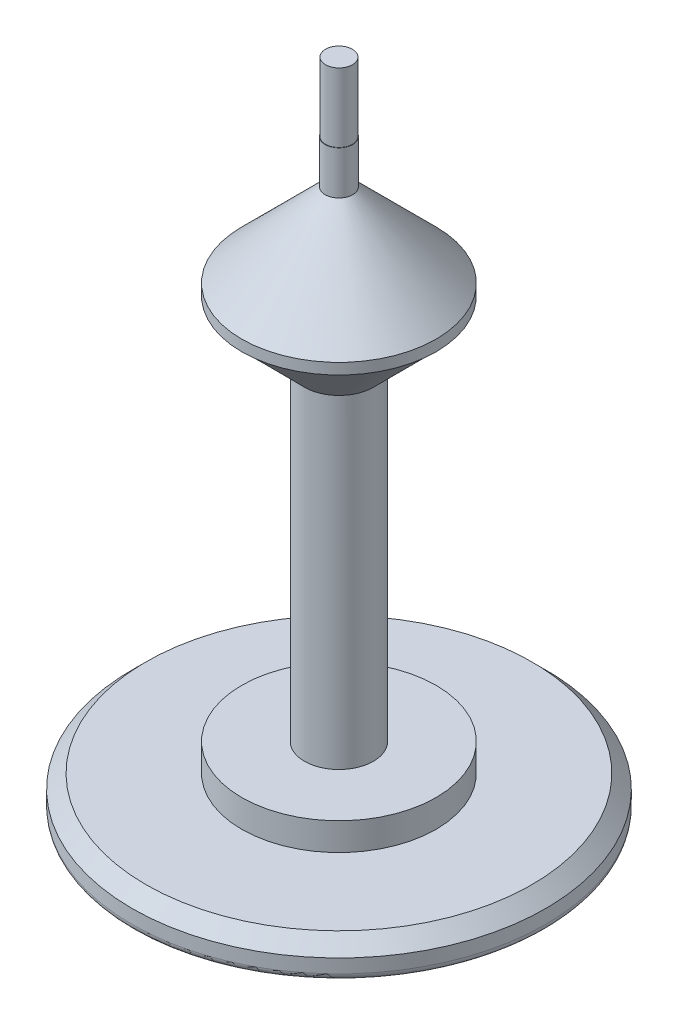
ISO-10303-21;
HEADER;
FILE_DESCRIPTION(('STEP AP214'),'2;1');
FILE_NAME('part.step','',(''),(''),'','','');
FILE_SCHEMA(('AUTOMOTIVE_DESIGN { 1 0 10303 214 1 1 1 1 }'));
ENDSEC;
DATA;
#1=APPLICATION_CONTEXT('core data for automotive mechanical design processes');
#2=APPLICATION_PROTOCOL_DEFINITION('international standard','automotive_design',2000,#1);
#3=PRODUCT_CONTEXT('',#1,'mechanical');
#4=PRODUCT('Part','Part','',(#3));
#5=PRODUCT_RELATED_PRODUCT_CATEGORY('part','',(#4));
#6=PRODUCT_DEFINITION_FORMATION('','',#4);
#7=PRODUCT_DEFINITION_CONTEXT('part definition',#1,'design');
#8=PRODUCT_DEFINITION('design','',#6,#7);
#9=PRODUCT_DEFINITION_SHAPE('','',#8);
#10=(LENGTH_UNIT() NAMED_UNIT(*) SI_UNIT(.MILLI.,.METRE.));
#11=(NAMED_UNIT(*) PLANE_ANGLE_UNIT() SI_UNIT($,.RADIAN.));
#12=(NAMED_UNIT(*) SI_UNIT($,.STERADIAN.) SOLID_ANGLE_UNIT());
#13=UNCERTAINTY_MEASURE_WITH_UNIT(LENGTH_MEASURE(1.E-05),#10,'distance_accuracy_value','');
#14=(GEOMETRIC_REPRESENTATION_CONTEXT(3) GLOBAL_UNCERTAINTY_ASSIGNED_CONTEXT((#13)) GLOBAL_UNIT_ASSIGNED_CONTEXT((#10,
#11,#12)) REPRESENTATION_CONTEXT('',''));
#15=CARTESIAN_POINT('',(0.,0.,0.));
#16=DIRECTION('',(0.,0.,1.));
#17=DIRECTION('',(1.,0.,0.));
#18=AXIS2_PLACEMENT_3D('',#15,#16,#17);
#19=CARTESIAN_POINT('',(0.,79.3548387096774,0.));
#20=DIRECTION('',(0.,1.,0.));
#21=DIRECTION('',(0.,0.,1.));
#22=AXIS2_PLACEMENT_3D('',#19,#20,#21);
#23=CYLINDRICAL_SURFACE('',#22,30.);
#24=CARTESIAN_POINT('',(0.,-52.1048387096774,0.));
#25=DIRECTION('',(0.,-1.,0.));
#26=DIRECTION('',(0.,0.,-1.));
#27=AXIS2_PLACEMENT_3D('',#24,#25,#26);
#28=CIRCLE('',#27,30.);
#29=CARTESIAN_POINT('',(0.,-52.1048387096774,-30.));
#30=VERTEX_POINT('',#29);
#31=EDGE_CURVE('E49',#30,#30,#28,.F.);
#32=ORIENTED_EDGE('',*,*,#31,.T.);
#33=EDGE_LOOP('',(#32));
#34=FACE_BOUND('',#33,.T.);
#35=CARTESIAN_POINT('',(0.,-50.1048387096775,0.));
#36=DIRECTION('',(0.,1.,0.));
#37=DIRECTION('',(0.,0.,1.));
#38=AXIS2_PLACEMENT_3D('',#35,#36,#37);
#39=CIRCLE('',#38,30.);
#40=CARTESIAN_POINT('',(0.,-50.1048387096775,30.));
#41=VERTEX_POINT('',#40);
#42=EDGE_CURVE('E54',#41,#41,#39,.F.);
#43=ORIENTED_EDGE('',*,*,#42,.T.);
#44=EDGE_LOOP('',(#43));
#45=FACE_BOUND('',#44,.T.);
#46=ADVANCED_FACE('F34',(#34,#45),#23,.T.);
#47=CARTESIAN_POINT('',(-30.,-48.1048387096774,0.));
#48=DIRECTION('',(0.,1.,0.));
#49=DIRECTION('',(0.,0.,1.));
#50=AXIS2_PLACEMENT_3D('',#47,#48,#49);
#51=PLANE('',#50);
#52=CARTESIAN_POINT('',(0.,-48.1048387096774,0.));
#53=DIRECTION('',(0.,1.,0.));
#54=DIRECTION('',(0.,0.,1.));
#55=AXIS2_PLACEMENT_3D('',#52,#53,#54);
#56=CIRCLE('',#55,27.9999999999999);
#57=CARTESIAN_POINT('',(0.,-48.1048387096774,27.9999999999999));
#58=VERTEX_POINT('',#57);
#59=EDGE_CURVE('E57',#58,#58,#56,.T.);
#60=ORIENTED_EDGE('',*,*,#59,.T.);
#61=EDGE_LOOP('',(#60));
#62=FACE_BOUND('',#61,.T.);
#63=CARTESIAN_POINT('',(0.,-48.1048387096774,0.));
#64=DIRECTION('',(0.,1.,0.));
#65=DIRECTION('',(0.,0.,1.));
#66=AXIS2_PLACEMENT_3D('',#63,#64,#65);
#67=CIRCLE('',#66,14.1);
#68=CARTESIAN_POINT('',(0.,-48.1048387096774,14.1));
#69=VERTEX_POINT('',#68);
#70=EDGE_CURVE('E66',#69,#69,#67,.T.);
#71=ORIENTED_EDGE('',*,*,#70,.F.);
#72=EDGE_LOOP('',(#71));
#73=FACE_BOUND('',#72,.T.);
#74=ADVANCED_FACE('F120',(#62,#73),#51,.T.);
#75=CARTESIAN_POINT('',(0.,79.3548387096774,0.));
#76=DIRECTION('',(0.,1.,0.));
#77=DIRECTION('',(0.,0.,1.));
#78=AXIS2_PLACEMENT_3D('',#75,#76,#77);
#79=CYLINDRICAL_SURFACE('',#78,14.1);
#80=ORIENTED_EDGE('',*,*,#70,.T.);
#81=EDGE_LOOP('',(#80));
#82=FACE_BOUND('',#81,.T.);
#83=CARTESIAN_POINT('',(0.,-44.1048387096774,0.));
#84=DIRECTION('',(0.,1.,0.));
#85=DIRECTION('',(0.,0.,1.));
#86=AXIS2_PLACEMENT_3D('',#83,#84,#85);
#87=CIRCLE('',#86,14.1);
#88=CARTESIAN_POINT('',(0.,-44.1048387096774,14.1));
#89=VERTEX_POINT('',#88);
#90=EDGE_CURVE('E69',#89,#89,#87,.T.);
#91=ORIENTED_EDGE('',*,*,#90,.F.);
#92=EDGE_LOOP('',(#91));
#93=FACE_BOUND('',#92,.T.);
#94=ADVANCED_FACE('F126',(#82,#93),#79,.T.);
#95=CARTESIAN_POINT('',(-14.1,-44.1048387096774,0.));
#96=DIRECTION('',(0.,1.,0.));
#97=DIRECTION('',(0.,0.,1.));
#98=AXIS2_PLACEMENT_3D('',#95,#96,#97);
#99=PLANE('',#98);
#100=ORIENTED_EDGE('',*,*,#90,.T.);
#101=EDGE_LOOP('',(#100));
#102=FACE_BOUND('',#101,.T.);
#103=CARTESIAN_POINT('',(0.,-44.1048387096774,0.));
#104=DIRECTION('',(0.,1.,0.));
#105=DIRECTION('',(0.,0.,1.));
#106=AXIS2_PLACEMENT_3D('',#103,#104,#105);
#107=CIRCLE('',#106,4.99999999999999);
#108=CARTESIAN_POINT('',(0.,-44.1048387096774,4.99999999999999));
#109=VERTEX_POINT('',#108);
#110=EDGE_CURVE('E72',#109,#109,#107,.T.);
#111=ORIENTED_EDGE('',*,*,#110,.F.);
#112=EDGE_LOOP('',(#111));
#113=FACE_BOUND('',#112,.T.);
#114=ADVANCED_FACE('F169',(#102,#113),#99,.T.);
#115=CARTESIAN_POINT('',(0.,79.3548387096774,0.));
#116=DIRECTION('',(0.,1.,0.));
#117=DIRECTION('',(0.,0.,1.));
#118=AXIS2_PLACEMENT_3D('',#115,#116,#117);
#119=CYLINDRICAL_SURFACE('',#118,4.99999999999999);
#120=CARTESIAN_POINT('',(0.,2.89516129032265,0.));
#121=DIRECTION('',(0.,-1.,0.));
#122=DIRECTION('',(0.,0.,-1.));
#123=AXIS2_PLACEMENT_3D('',#120,#121,#122);
#124=CIRCLE('',#123,4.99999999999999);
#125=CARTESIAN_POINT('',(0.,2.89516129032265,-4.99999999999999));
#126=VERTEX_POINT('',#125);
#127=EDGE_CURVE('E10',#126,#126,#124,.T.);
#128=ORIENTED_EDGE('',*,*,#127,.T.);
#129=EDGE_LOOP('',(#128));
#130=FACE_BOUND('',#129,.T.);
#131=ORIENTED_EDGE('',*,*,#110,.T.);
#132=EDGE_LOOP('',(#131));
#133=FACE_BOUND('',#132,.T.);
#134=ADVANCED_FACE('F159',(#130,#133),#119,.T.);
#135=CARTESIAN_POINT('',(-4.99999999999999,11.8951612903226,0.));
#136=DIRECTION('',(0.,-1.,0.));
#137=DIRECTION('',(0.,0.,-1.));
#138=AXIS2_PLACEMENT_3D('',#135,#136,#137);
#139=PLANE('',#138);
#140=CARTESIAN_POINT('',(0.,11.8951612903226,0.));
#141=DIRECTION('',(0.,-1.,0.));
#142=DIRECTION('',(0.,0.,-1.));
#143=AXIS2_PLACEMENT_3D('',#140,#141,#142);
#144=CIRCLE('',#143,14.);
#145=CARTESIAN_POINT('',(0.,11.8951612903226,-14.));
#146=VERTEX_POINT('',#145);
#147=EDGE_CURVE('E41',#146,#146,#144,.F.);
#148=ORIENTED_EDGE('',*,*,#147,.T.);
#149=EDGE_LOOP('',(#148));
#150=FACE_BOUND('',#149,.T.);
#151=CARTESIAN_POINT('',(0.,11.8951612903226,0.));
#152=DIRECTION('',(0.,1.,0.));
#153=DIRECTION('',(0.,0.,1.));
#154=AXIS2_PLACEMENT_3D('',#151,#152,#153);
#155=CIRCLE('',#154,14.1);
#156=CARTESIAN_POINT('',(0.,11.8951612903226,14.1));
#157=VERTEX_POINT('',#156);
#158=EDGE_CURVE('E75',#157,#157,#155,.T.);
#159=ORIENTED_EDGE('',*,*,#158,.F.);
#160=EDGE_LOOP('',(#159));
#161=FACE_BOUND('',#160,.T.);
#162=ADVANCED_FACE('F154',(#150,#161),#139,.T.);
#163=CARTESIAN_POINT('',(0.,79.3548387096774,0.));
#164=DIRECTION('',(0.,1.,0.));
#165=DIRECTION('',(0.,0.,1.));
#166=AXIS2_PLACEMENT_3D('',#163,#164,#165);
#167=CYLINDRICAL_SURFACE('',#166,14.1);
#168=CARTESIAN_POINT('',(0.,13.4889435076735,0.));
#169=DIRECTION('',(0.,-1.,0.));
#170=DIRECTION('',(0.,0.,-1.));
#171=AXIS2_PLACEMENT_3D('',#168,#169,#170);
#172=CIRCLE('',#171,14.1);
#173=CARTESIAN_POINT('',(0.,13.4889435076735,-14.1));
#174=VERTEX_POINT('',#173);
#175=EDGE_CURVE('E61',#174,#174,#172,.F.);
#176=ORIENTED_EDGE('',*,*,#175,.F.);
#177=EDGE_LOOP('',(#176));
#178=FACE_BOUND('',#177,.T.);
#179=ORIENTED_EDGE('',*,*,#158,.T.);
#180=EDGE_LOOP('',(#179));
#181=FACE_BOUND('',#180,.T.);
#182=ADVANCED_FACE('F116',(#178,#181),#167,.T.);
#183=CARTESIAN_POINT('',(-30.,-53.1048387096774,0.));
#184=DIRECTION('',(0.,-1.,0.));
#185=DIRECTION('',(0.,0.,-1.));
#186=AXIS2_PLACEMENT_3D('',#183,#184,#185);
#187=PLANE('',#186);
#188=CARTESIAN_POINT('',(0.,-53.1048387096774,0.));
#189=DIRECTION('',(0.,-1.,0.));
#190=DIRECTION('',(0.,0.,-1.));
#191=AXIS2_PLACEMENT_3D('',#188,#189,#190);
#192=CIRCLE('',#191,29.);
#193=CARTESIAN_POINT('',(0.,-53.1048387096774,-29.));
#194=VERTEX_POINT('',#193);
#195=EDGE_CURVE('E45',#194,#194,#192,.T.);
#196=ORIENTED_EDGE('',*,*,#195,.T.);
#197=EDGE_LOOP('',(#196));
#198=FACE_BOUND('',#197,.T.);
#199=ADVANCED_FACE('F110',(#198),#187,.T.);
#200=CARTESIAN_POINT('',(0.,13.3389435076735,0.));
#201=DIRECTION('',(0.,-1.,0.));
#202=DIRECTION('',(0.,0.,-1.));
#203=AXIS2_PLACEMENT_3D('',#200,#201,#202);
#204=CONICAL_SURFACE('',#203,14.25,0.78539816339745);
#205=CARTESIAN_POINT('',(0.,25.5889435076734,0.));
#206=DIRECTION('',(0.,1.,0.));
#207=DIRECTION('',(0.,0.,1.));
#208=AXIS2_PLACEMENT_3D('',#205,#206,#207);
#209=CIRCLE('',#208,2.);
#210=CARTESIAN_POINT('',(0.,25.5889435076734,-2.));
#211=VERTEX_POINT('',#210);
#212=EDGE_CURVE('E65',#211,#211,#209,.T.);
#213=CARTESIAN_POINT('',(0.,13.4889435076735,-14.1));
#214=CARTESIAN_POINT('',(0.,13.6149851743402,-13.9739583333333));
#215=CARTESIAN_POINT('',(0.,13.7410268410068,-13.8479166666667));
#216=CARTESIAN_POINT('',(0.,13.9931101743402,-13.5958333333333));
#217=CARTESIAN_POINT('',(0.,14.1191518410068,-13.4697916666667));
#218=CARTESIAN_POINT('',(0.,14.3712351743402,-13.2177083333333));
#219=CARTESIAN_POINT('',(0.,14.4972768410068,-13.0916666666667));
#220=CARTESIAN_POINT('',(0.,14.7493601743402,-12.8395833333333));
#221=CARTESIAN_POINT('',(0.,14.8754018410068,-12.7135416666667));
#222=CARTESIAN_POINT('',(0.,15.1274851743402,-12.4614583333333));
#223=CARTESIAN_POINT('',(0.,15.2535268410068,-12.3354166666667));
#224=CARTESIAN_POINT('',(0.,15.5056101743402,-12.0833333333333));
#225=CARTESIAN_POINT('',(0.,15.6316518410068,-11.9572916666667));
#226=CARTESIAN_POINT('',(0.,15.8837351743402,-11.7052083333333));
#227=CARTESIAN_POINT('',(0.,16.0097768410068,-11.5791666666667));
#228=CARTESIAN_POINT('',(0.,16.2618601743402,-11.3270833333333));
#229=CARTESIAN_POINT('',(0.,16.3879018410068,-11.2010416666667));
#230=CARTESIAN_POINT('',(0.,16.6399851743402,-10.9489583333333));
#231=CARTESIAN_POINT('',(0.,16.7660268410068,-10.8229166666667));
#232=CARTESIAN_POINT('',(0.,17.0181101743401,-10.5708333333333));
#233=CARTESIAN_POINT('',(0.,17.1441518410068,-10.4447916666667));
#234=CARTESIAN_POINT('',(0.,17.3962351743401,-10.1927083333333));
#235=CARTESIAN_POINT('',(0.,17.5222768410068,-10.0666666666667));
#236=CARTESIAN_POINT('',(0.,17.7743601743401,-9.81458333333332));
#237=CARTESIAN_POINT('',(0.,17.9004018410068,-9.68854166666666));
#238=CARTESIAN_POINT('',(0.,18.1524851743401,-9.43645833333332));
#239=CARTESIAN_POINT('',(0.,18.2785268410068,-9.31041666666665));
#240=CARTESIAN_POINT('',(0.,18.5306101743401,-9.05833333333332));
#241=CARTESIAN_POINT('',(0.,18.6566518410068,-8.93229166666665));
#242=CARTESIAN_POINT('',(0.,18.9087351743401,-8.68020833333332));
#243=CARTESIAN_POINT('',(0.,19.0347768410068,-8.55416666666665));
#244=CARTESIAN_POINT('',(0.,19.2868601743401,-8.30208333333332));
#245=CARTESIAN_POINT('',(0.,19.4129018410068,-8.17604166666666));
#246=CARTESIAN_POINT('',(0.,19.6649851743401,-7.92395833333332));
#247=CARTESIAN_POINT('',(0.,19.7910268410068,-7.79791666666666));
#248=CARTESIAN_POINT('',(0.,20.0431101743401,-7.54583333333332));
#249=CARTESIAN_POINT('',(0.,20.1691518410068,-7.41979166666666));
#250=CARTESIAN_POINT('',(0.,20.4212351743401,-7.16770833333333));
#251=CARTESIAN_POINT('',(0.,20.5472768410068,-7.04166666666666));
#252=CARTESIAN_POINT('',(0.,20.7993601743401,-6.78958333333333));
#253=CARTESIAN_POINT('',(0.,20.9254018410068,-6.66354166666666));
#254=CARTESIAN_POINT('',(0.,21.1774851743401,-6.41145833333333));
#255=CARTESIAN_POINT('',(0.,21.3035268410068,-6.28541666666666));
#256=CARTESIAN_POINT('',(0.,21.5556101743401,-6.03333333333333));
#257=CARTESIAN_POINT('',(0.,21.6816518410068,-5.90729166666666));
#258=CARTESIAN_POINT('',(0.,21.9337351743401,-5.65520833333333));
#259=CARTESIAN_POINT('',(0.,22.0597768410068,-5.52916666666666));
#260=CARTESIAN_POINT('',(0.,22.3118601743401,-5.27708333333333));
#261=CARTESIAN_POINT('',(0.,22.4379018410068,-5.15104166666666));
#262=CARTESIAN_POINT('',(0.,22.6899851743401,-4.89895833333333));
#263=CARTESIAN_POINT('',(0.,22.8160268410068,-4.77291666666666));
#264=CARTESIAN_POINT('',(0.,23.0681101743401,-4.52083333333333));
#265=CARTESIAN_POINT('',(0.,23.1941518410068,-4.39479166666666));
#266=CARTESIAN_POINT('',(0.,23.4462351743401,-4.14270833333333));
#267=CARTESIAN_POINT('',(0.,23.5722768410068,-4.01666666666666));
#268=CARTESIAN_POINT('',(0.,23.8243601743401,-3.76458333333333));
#269=CARTESIAN_POINT('',(0.,23.9504018410068,-3.63854166666666));
#270=CARTESIAN_POINT('',(0.,24.2024851743401,-3.38645833333333));
#271=CARTESIAN_POINT('',(0.,24.3285268410068,-3.26041666666666));
#272=CARTESIAN_POINT('',(0.,24.5806101743401,-3.00833333333333));
#273=CARTESIAN_POINT('',(0.,24.7066518410068,-2.88229166666666));
#274=CARTESIAN_POINT('',(0.,24.9587351743401,-2.63020833333333));
#275=CARTESIAN_POINT('',(0.,25.0847768410068,-2.50416666666666));
#276=CARTESIAN_POINT('',(0.,25.3368601743401,-2.25208333333333));
#277=CARTESIAN_POINT('',(0.,25.4629018410068,-2.12604166666666));
#278=CARTESIAN_POINT('',(0.,25.5889435076734,-2.));
#279=B_SPLINE_CURVE_WITH_KNOTS('',3,(#213,#214,#215,#216,#217,#218,#219,#220,#221,#222,#223,
#224,#225,#226,#227,#228,#229,#230,#231,#232,#233,#234,#235,#236,#237,#238,#239,#240,#241,#242,
#243,#244,#245,#246,#247,#248,#249,#250,#251,#252,#253,#254,#255,#256,#257,#258,#259,#260,#261,
#262,#263,#264,#265,#266,#267,#268,#269,#270,#271,#272,#273,#274,#275,#276,#277,#278),
.UNSPECIFIED.,.F.,.F.,(4,2,2,2,2,2,2,2,2,2,2,2,2,2,2,2,2,2,2,2,2,2,2,2,2,2,2,2,2,2,2,2,4),(0.,
0.534749503272325,1.06949900654465,1.60424850981698,2.1389980130893,2.67374751636163,
3.20849701963395,3.74324652290628,4.2779960261786,4.81274552945093,5.34749503272325,
5.88224453599558,6.4169940392679,6.95174354254023,7.48649304581255,8.02124254908488,
8.5559920523572,9.09074155562953,9.62549105890185,10.1602405621742,10.6949900654465,
11.2297395687188,11.7644890719912,12.2992385752635,12.8339880785358,13.3687375818081,
13.9034870850805,14.4382365883528,14.9729860916251,15.5077355948974,16.0424850981698,
16.5772346014421,17.1119841047144),.UNSPECIFIED.);
#280=EDGE_CURVE('BSEAM100',#174,#211,#279,.T.);
#281=ORIENTED_EDGE('',*,*,#175,.T.);
#282=ORIENTED_EDGE('',*,*,#212,.F.);
#283=ORIENTED_EDGE('',*,*,#280,.T.);
#284=ORIENTED_EDGE('',*,*,#280,.F.);
#285=EDGE_LOOP('',(#281,#283,#282,#284));
#286=FACE_BOUND('',#285,.T.);
#287=ADVANCED_FACE('F100',(#286),#204,.T.);
#288=CARTESIAN_POINT('',(-1.99999999999998,31.8951612903226,0.));
#289=DIRECTION('',(0.,1.,0.));
#290=DIRECTION('',(0.,0.,1.));
#291=AXIS2_PLACEMENT_3D('',#288,#289,#290);
#292=PLANE('',#291);
#293=CARTESIAN_POINT('',(0.,31.8951612903226,0.));
#294=DIRECTION('',(0.,1.,0.));
#295=DIRECTION('',(0.,0.,1.));
#296=AXIS2_PLACEMENT_3D('',#293,#294,#295);
#297=CIRCLE('',#296,1.95);
#298=CARTESIAN_POINT('',(0.,31.8951612903226,1.95));
#299=VERTEX_POINT('',#298);
#300=EDGE_CURVE('E60',#299,#299,#297,.T.);
#301=ORIENTED_EDGE('',*,*,#300,.F.);
#302=EDGE_LOOP('',(#301));
#303=FACE_BOUND('',#302,.T.);
#304=CARTESIAN_POINT('',(0.,31.8951612903226,0.));
#305=DIRECTION('',(0.,1.,0.));
#306=DIRECTION('',(0.,0.,1.));
#307=AXIS2_PLACEMENT_3D('',#304,#305,#306);
#308=CIRCLE('',#307,1.99999999999998);
#309=CARTESIAN_POINT('',(0.,31.8951612903226,1.99999999999998));
#310=VERTEX_POINT('',#309);
#311=EDGE_CURVE('E64',#310,#310,#308,.T.);
#312=ORIENTED_EDGE('',*,*,#311,.T.);
#313=EDGE_LOOP('',(#312));
#314=FACE_BOUND('',#313,.T.);
#315=ADVANCED_FACE('F97',(#303,#314),#292,.T.);
#316=CARTESIAN_POINT('',(0.,79.3548387096774,0.));
#317=DIRECTION('',(0.,1.,0.));
#318=DIRECTION('',(0.,0.,1.));
#319=AXIS2_PLACEMENT_3D('',#316,#317,#318);
#320=CYLINDRICAL_SURFACE('',#319,1.99999999999998);
#321=ORIENTED_EDGE('',*,*,#311,.F.);
#322=EDGE_LOOP('',(#321));
#323=FACE_BOUND('',#322,.T.);
#324=ORIENTED_EDGE('',*,*,#212,.T.);
#325=EDGE_LOOP('',(#324));
#326=FACE_BOUND('',#325,.T.);
#327=ADVANCED_FACE('F93',(#323,#326),#320,.T.);
#328=CARTESIAN_POINT('',(0.,41.8951612903226,0.));
#329=DIRECTION('',(0.,-1.,0.));
#330=DIRECTION('',(0.,0.,-1.));
#331=AXIS2_PLACEMENT_3D('',#328,#329,#330);
#332=CYLINDRICAL_SURFACE('',#331,1.95);
#333=CARTESIAN_POINT('',(0.,41.8951612903226,0.));
#334=DIRECTION('',(0.,1.,0.));
#335=DIRECTION('',(0.,0.,1.));
#336=AXIS2_PLACEMENT_3D('',#333,#334,#335);
#337=CIRCLE('',#336,1.95);
#338=CARTESIAN_POINT('',(0.,41.8951612903226,1.95));
#339=VERTEX_POINT('',#338);
#340=EDGE_CURVE('E82',#339,#339,#337,.T.);
#341=ORIENTED_EDGE('',*,*,#340,.F.);
#342=EDGE_LOOP('',(#341));
#343=FACE_BOUND('',#342,.T.);
#344=ORIENTED_EDGE('',*,*,#300,.T.);
#345=EDGE_LOOP('',(#344));
#346=FACE_BOUND('',#345,.T.);
#347=ADVANCED_FACE('F90',(#343,#346),#332,.T.);
#348=CARTESIAN_POINT('',(0.,41.8951612903226,0.));
#349=DIRECTION('',(0.,1.,0.));
#350=DIRECTION('',(0.,0.,1.));
#351=AXIS2_PLACEMENT_3D('',#348,#349,#350);
#352=PLANE('',#351);
#353=ORIENTED_EDGE('',*,*,#340,.T.);
#354=EDGE_LOOP('',(#353));
#355=FACE_BOUND('',#354,.T.);
#356=ADVANCED_FACE('F88',(#355),#352,.T.);
#357=CARTESIAN_POINT('',(0.,-48.1048387096774,0.));
#358=DIRECTION('',(0.,-1.,0.));
#359=DIRECTION('',(0.,0.,-1.));
#360=AXIS2_PLACEMENT_3D('',#357,#358,#359);
#361=CONICAL_SURFACE('',#360,28.,0.785398163397448);
#362=ORIENTED_EDGE('',*,*,#42,.F.);
#363=EDGE_LOOP('',(#362));
#364=FACE_BOUND('',#363,.T.);
#365=ORIENTED_EDGE('',*,*,#59,.F.);
#366=EDGE_LOOP('',(#365));
#367=FACE_BOUND('',#366,.T.);
#368=ADVANCED_FACE('F132',(#364,#367),#361,.T.);
#369=CARTESIAN_POINT('',(0.,-52.1048387096774,0.));
#370=DIRECTION('',(0.,-1.,0.));
#371=DIRECTION('',(0.,0.,-1.));
#372=AXIS2_PLACEMENT_3D('',#369,#370,#371);
#373=TOROIDAL_SURFACE('',#372,29.,1.);
#374=ORIENTED_EDGE('',*,*,#195,.F.);
#375=EDGE_LOOP('',(#374));
#376=FACE_BOUND('',#375,.T.);
#377=ORIENTED_EDGE('',*,*,#31,.F.);
#378=EDGE_LOOP('',(#377));
#379=FACE_BOUND('',#378,.T.);
#380=ADVANCED_FACE('F134',(#376,#379),#373,.T.);
#381=CARTESIAN_POINT('',(0.,11.8951612903226,0.));
#382=DIRECTION('',(0.,1.,0.));
#383=DIRECTION('',(0.,0.,1.));
#384=AXIS2_PLACEMENT_3D('',#381,#382,#383);
#385=CONICAL_SURFACE('',#384,14.,0.785398163397454);
#386=ORIENTED_EDGE('',*,*,#127,.F.);
#387=EDGE_LOOP('',(#386));
#388=FACE_BOUND('',#387,.T.);
#389=ORIENTED_EDGE('',*,*,#147,.F.);
#390=EDGE_LOOP('',(#389));
#391=FACE_BOUND('',#390,.T.);
#392=ADVANCED_FACE('F36',(#388,#391),#385,.T.);
#393=CLOSED_SHELL('',(#46,#74,#94,#114,#134,#162,#182,#199,#287,#315,#327,#347,#356,#368,#380,#392));
#394=MANIFOLD_SOLID_BREP('B2',#393);
#395=ADVANCED_BREP_SHAPE_REPRESENTATION('',(#18,#394),#14);
#396=SHAPE_DEFINITION_REPRESENTATION(#9,#395);
ENDSEC;
END-ISO-10303-21;
